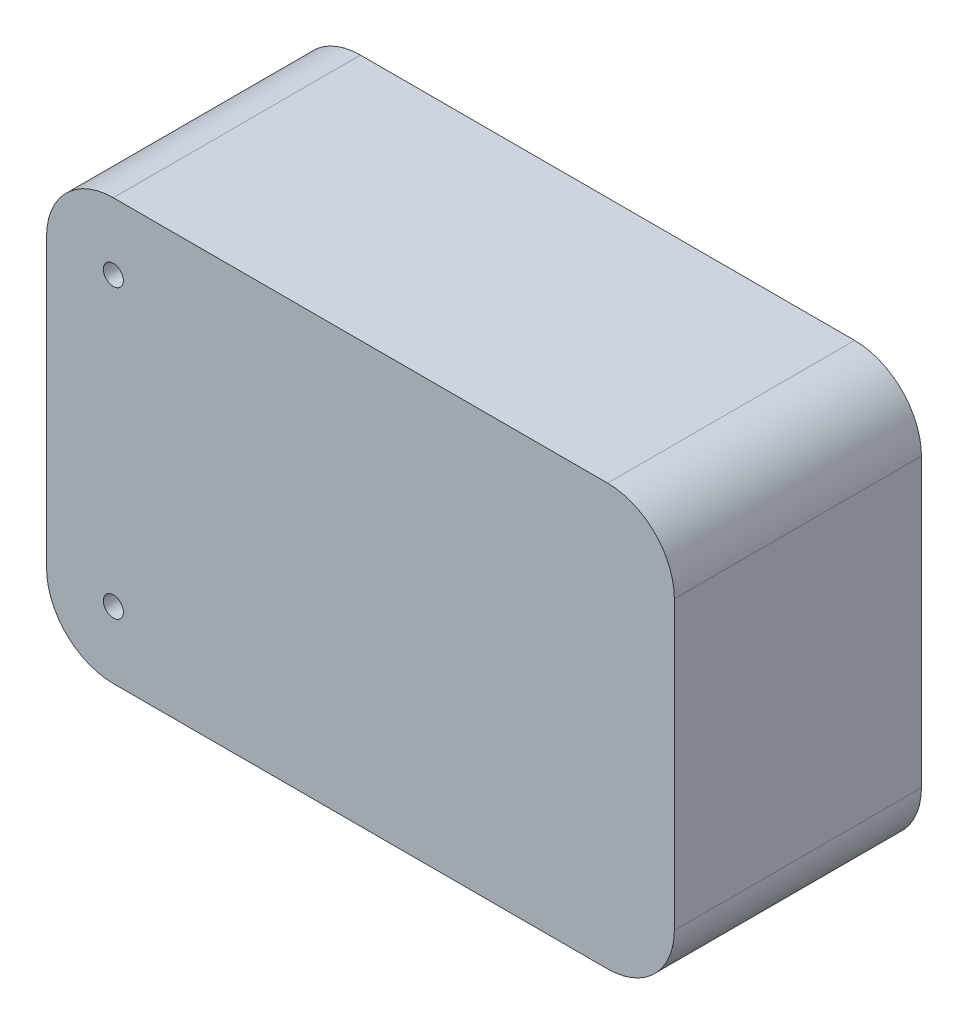
ISO-10303-21;
HEADER;
FILE_DESCRIPTION(('STEP AP214'),'2;1');
FILE_NAME('part.step','',(''),(''),'','','');
FILE_SCHEMA(('AUTOMOTIVE_DESIGN { 1 0 10303 214 1 1 1 1 }'));
ENDSEC;
DATA;
#1=APPLICATION_CONTEXT('core data for automotive mechanical design processes');
#2=APPLICATION_PROTOCOL_DEFINITION('international standard','automotive_design',2000,#1);
#3=PRODUCT_CONTEXT('',#1,'mechanical');
#4=PRODUCT('Part','Part','',(#3));
#5=PRODUCT_RELATED_PRODUCT_CATEGORY('part','',(#4));
#6=PRODUCT_DEFINITION_FORMATION('','',#4);
#7=PRODUCT_DEFINITION_CONTEXT('part definition',#1,'design');
#8=PRODUCT_DEFINITION('design','',#6,#7);
#9=PRODUCT_DEFINITION_SHAPE('','',#8);
#10=(LENGTH_UNIT() NAMED_UNIT(*) SI_UNIT(.MILLI.,.METRE.));
#11=(NAMED_UNIT(*) PLANE_ANGLE_UNIT() SI_UNIT($,.RADIAN.));
#12=(NAMED_UNIT(*) SI_UNIT($,.STERADIAN.) SOLID_ANGLE_UNIT());
#13=UNCERTAINTY_MEASURE_WITH_UNIT(LENGTH_MEASURE(1.E-05),#10,'distance_accuracy_value','');
#14=(GEOMETRIC_REPRESENTATION_CONTEXT(3) GLOBAL_UNCERTAINTY_ASSIGNED_CONTEXT((#13)) GLOBAL_UNIT_ASSIGNED_CONTEXT((#10,
#11,#12)) REPRESENTATION_CONTEXT('',''));
#15=CARTESIAN_POINT('',(0.,0.,0.));
#16=DIRECTION('',(0.,0.,1.));
#17=DIRECTION('',(1.,0.,0.));
#18=AXIS2_PLACEMENT_3D('',#15,#16,#17);
#19=CARTESIAN_POINT('',(-49.5555555555556,31.,37.));
#20=DIRECTION('',(1.,0.,0.));
#21=DIRECTION('',(0.,0.,-1.));
#22=AXIS2_PLACEMENT_3D('',#19,#20,#21);
#23=PLANE('',#22);
#24=DIRECTION('',(0.,-1.,0.));
#25=VECTOR('',#24,1.);
#26=CARTESIAN_POINT('',(-49.5555555555556,31.,37.));
#27=LINE('',#26,#25);
#28=CARTESIAN_POINT('',(-49.5555555555556,21.,37.));
#29=VERTEX_POINT('',#28);
#30=CARTESIAN_POINT('',(-49.5555555555556,-22.,37.));
#31=VERTEX_POINT('',#30);
#32=EDGE_CURVE('E116',#29,#31,#27,.T.);
#33=ORIENTED_EDGE('',*,*,#32,.F.);
#34=DIRECTION('',(0.,0.,-1.));
#35=VECTOR('',#34,1.);
#36=CARTESIAN_POINT('',(-49.5555555555556,21.,37.));
#37=LINE('',#36,#35);
#38=CARTESIAN_POINT('',(-49.5555555555556,21.,0.));
#39=VERTEX_POINT('',#38);
#40=EDGE_CURVE('E101',#29,#39,#37,.T.);
#41=ORIENTED_EDGE('',*,*,#40,.T.);
#42=DIRECTION('',(0.,-1.,0.));
#43=VECTOR('',#42,1.);
#44=CARTESIAN_POINT('',(-49.5555555555556,31.,0.));
#45=LINE('',#44,#43);
#46=CARTESIAN_POINT('',(-49.5555555555556,-22.,0.));
#47=VERTEX_POINT('',#46);
#48=EDGE_CURVE('E113',#39,#47,#45,.T.);
#49=ORIENTED_EDGE('',*,*,#48,.T.);
#50=DIRECTION('',(0.,0.,-1.));
#51=VECTOR('',#50,1.);
#52=CARTESIAN_POINT('',(-49.5555555555556,-22.,37.));
#53=LINE('',#52,#51);
#54=EDGE_CURVE('E118',#47,#31,#53,.F.);
#55=ORIENTED_EDGE('',*,*,#54,.T.);
#56=EDGE_LOOP('',(#33,#41,#49,#55));
#57=FACE_BOUND('',#56,.T.);
#58=ADVANCED_FACE('F32',(#57),#23,.F.);
#59=CARTESIAN_POINT('',(-49.5555555555556,-32.,37.));
#60=DIRECTION('',(0.,1.,0.));
#61=DIRECTION('',(0.,0.,1.));
#62=AXIS2_PLACEMENT_3D('',#59,#60,#61);
#63=PLANE('',#62);
#64=DIRECTION('',(1.,0.,0.));
#65=VECTOR('',#64,1.);
#66=CARTESIAN_POINT('',(-49.5555555555556,-32.,37.));
#67=LINE('',#66,#65);
#68=CARTESIAN_POINT('',(-39.5555555555556,-32.,37.));
#69=VERTEX_POINT('',#68);
#70=CARTESIAN_POINT('',(34.4444444444445,-32.,37.));
#71=VERTEX_POINT('',#70);
#72=EDGE_CURVE('E171',#69,#71,#67,.T.);
#73=ORIENTED_EDGE('',*,*,#72,.F.);
#74=DIRECTION('',(0.,0.,-1.));
#75=VECTOR('',#74,1.);
#76=CARTESIAN_POINT('',(-39.5555555555556,-32.,37.));
#77=LINE('',#76,#75);
#78=CARTESIAN_POINT('',(-39.5555555555556,-32.,0.));
#79=VERTEX_POINT('',#78);
#80=EDGE_CURVE('E155',#69,#79,#77,.T.);
#81=ORIENTED_EDGE('',*,*,#80,.T.);
#82=DIRECTION('',(1.,0.,0.));
#83=VECTOR('',#82,1.);
#84=CARTESIAN_POINT('',(-49.5555555555556,-32.,0.));
#85=LINE('',#84,#83);
#86=CARTESIAN_POINT('',(34.4444444444445,-32.,0.));
#87=VERTEX_POINT('',#86);
#88=EDGE_CURVE('E122',#79,#87,#85,.T.);
#89=ORIENTED_EDGE('',*,*,#88,.T.);
#90=DIRECTION('',(0.,0.,-1.));
#91=VECTOR('',#90,1.);
#92=CARTESIAN_POINT('',(34.4444444444445,-32.,37.));
#93=LINE('',#92,#91);
#94=EDGE_CURVE('E153',#87,#71,#93,.F.);
#95=ORIENTED_EDGE('',*,*,#94,.T.);
#96=EDGE_LOOP('',(#73,#81,#89,#95));
#97=FACE_BOUND('',#96,.T.);
#98=ADVANCED_FACE('F211',(#97),#63,.F.);
#99=CARTESIAN_POINT('',(44.4444444444444,31.,37.));
#100=DIRECTION('',(-1.,0.,0.));
#101=DIRECTION('',(0.,-1.,0.));
#102=AXIS2_PLACEMENT_3D('',#99,#100,#101);
#103=PLANE('',#102);
#104=DIRECTION('',(0.,1.,0.));
#105=VECTOR('',#104,1.);
#106=CARTESIAN_POINT('',(44.4444444444444,31.,0.));
#107=LINE('',#106,#105);
#108=CARTESIAN_POINT('',(44.4444444444445,-22.,0.));
#109=VERTEX_POINT('',#108);
#110=CARTESIAN_POINT('',(44.4444444444444,21.,0.));
#111=VERTEX_POINT('',#110);
#112=EDGE_CURVE('E126',#109,#111,#107,.T.);
#113=ORIENTED_EDGE('',*,*,#112,.T.);
#114=DIRECTION('',(0.,0.,-1.));
#115=VECTOR('',#114,1.);
#116=CARTESIAN_POINT('',(44.4444444444444,21.,37.));
#117=LINE('',#116,#115);
#118=CARTESIAN_POINT('',(44.4444444444444,21.,37.));
#119=VERTEX_POINT('',#118);
#120=EDGE_CURVE('E11',#111,#119,#117,.F.);
#121=ORIENTED_EDGE('',*,*,#120,.T.);
#122=DIRECTION('',(0.,1.,0.));
#123=VECTOR('',#122,1.);
#124=CARTESIAN_POINT('',(44.4444444444444,31.,37.));
#125=LINE('',#124,#123);
#126=CARTESIAN_POINT('',(44.4444444444445,-22.,37.));
#127=VERTEX_POINT('',#126);
#128=EDGE_CURVE('E161',#127,#119,#125,.T.);
#129=ORIENTED_EDGE('',*,*,#128,.F.);
#130=DIRECTION('',(0.,0.,-1.));
#131=VECTOR('',#130,1.);
#132=CARTESIAN_POINT('',(44.4444444444445,-22.,37.));
#133=LINE('',#132,#131);
#134=EDGE_CURVE('E40',#127,#109,#133,.T.);
#135=ORIENTED_EDGE('',*,*,#134,.T.);
#136=EDGE_LOOP('',(#113,#121,#129,#135));
#137=FACE_BOUND('',#136,.T.);
#138=ADVANCED_FACE('F160',(#137),#103,.F.);
#139=CARTESIAN_POINT('',(-49.5555555555556,31.,37.));
#140=DIRECTION('',(0.,-1.,0.));
#141=DIRECTION('',(0.,0.,-1.));
#142=AXIS2_PLACEMENT_3D('',#139,#140,#141);
#143=PLANE('',#142);
#144=DIRECTION('',(-1.,0.,0.));
#145=VECTOR('',#144,1.);
#146=CARTESIAN_POINT('',(-49.5555555555556,31.,0.));
#147=LINE('',#146,#145);
#148=CARTESIAN_POINT('',(34.4444444444444,31.,0.));
#149=VERTEX_POINT('',#148);
#150=CARTESIAN_POINT('',(-39.5555555555556,31.,0.));
#151=VERTEX_POINT('',#150);
#152=EDGE_CURVE('E136',#149,#151,#147,.T.);
#153=ORIENTED_EDGE('',*,*,#152,.T.);
#154=DIRECTION('',(0.,0.,-1.));
#155=VECTOR('',#154,1.);
#156=CARTESIAN_POINT('',(-39.5555555555556,31.,37.));
#157=LINE('',#156,#155);
#158=CARTESIAN_POINT('',(-39.5555555555556,31.,37.));
#159=VERTEX_POINT('',#158);
#160=EDGE_CURVE('E102',#151,#159,#157,.F.);
#161=ORIENTED_EDGE('',*,*,#160,.T.);
#162=DIRECTION('',(-1.,0.,0.));
#163=VECTOR('',#162,1.);
#164=CARTESIAN_POINT('',(-49.5555555555556,31.,37.));
#165=LINE('',#164,#163);
#166=CARTESIAN_POINT('',(34.4444444444444,31.,37.));
#167=VERTEX_POINT('',#166);
#168=EDGE_CURVE('E132',#167,#159,#165,.T.);
#169=ORIENTED_EDGE('',*,*,#168,.F.);
#170=DIRECTION('',(0.,0.,-1.));
#171=VECTOR('',#170,1.);
#172=CARTESIAN_POINT('',(34.4444444444444,31.,37.));
#173=LINE('',#172,#171);
#174=EDGE_CURVE('E107',#167,#149,#173,.T.);
#175=ORIENTED_EDGE('',*,*,#174,.T.);
#176=EDGE_LOOP('',(#153,#161,#169,#175));
#177=FACE_BOUND('',#176,.T.);
#178=ADVANCED_FACE('F169',(#177),#143,.F.);
#179=CARTESIAN_POINT('',(0.,0.,37.));
#180=DIRECTION('',(0.,0.,1.));
#181=DIRECTION('',(1.,0.,0.));
#182=AXIS2_PLACEMENT_3D('',#179,#180,#181);
#183=PLANE('',#182);
#184=CARTESIAN_POINT('',(-39.5555555555556,21.,37.));
#185=DIRECTION('',(0.,0.,1.));
#186=DIRECTION('',(1.,0.,0.));
#187=AXIS2_PLACEMENT_3D('',#184,#185,#186);
#188=CIRCLE('',#187,1.5);
#189=CARTESIAN_POINT('',(-38.0555555555556,21.,37.));
#190=VERTEX_POINT('',#189);
#191=EDGE_CURVE('E178',#190,#190,#188,.T.);
#192=ORIENTED_EDGE('',*,*,#191,.F.);
#193=EDGE_LOOP('',(#192));
#194=FACE_BOUND('',#193,.T.);
#195=CARTESIAN_POINT('',(-39.5555555555556,-22.,37.));
#196=DIRECTION('',(0.,0.,1.));
#197=DIRECTION('',(1.,0.,0.));
#198=AXIS2_PLACEMENT_3D('',#195,#196,#197);
#199=CIRCLE('',#198,1.5);
#200=CARTESIAN_POINT('',(-38.0555555555556,-22.,37.));
#201=VERTEX_POINT('',#200);
#202=EDGE_CURVE('E129',#201,#201,#199,.T.);
#203=ORIENTED_EDGE('',*,*,#202,.F.);
#204=EDGE_LOOP('',(#203));
#205=FACE_BOUND('',#204,.T.);
#206=ORIENTED_EDGE('',*,*,#168,.T.);
#207=CARTESIAN_POINT('',(-39.5555555555556,21.,37.));
#208=DIRECTION('',(0.,0.,1.));
#209=DIRECTION('',(1.,0.,0.));
#210=AXIS2_PLACEMENT_3D('',#207,#208,#209);
#211=CIRCLE('',#210,10.);
#212=EDGE_CURVE('E151',#159,#29,#211,.T.);
#213=ORIENTED_EDGE('',*,*,#212,.T.);
#214=ORIENTED_EDGE('',*,*,#32,.T.);
#215=CARTESIAN_POINT('',(-39.5555555555556,-22.,37.));
#216=DIRECTION('',(0.,0.,1.));
#217=DIRECTION('',(1.,0.,0.));
#218=AXIS2_PLACEMENT_3D('',#215,#216,#217);
#219=CIRCLE('',#218,10.);
#220=EDGE_CURVE('E149',#31,#69,#219,.T.);
#221=ORIENTED_EDGE('',*,*,#220,.T.);
#222=ORIENTED_EDGE('',*,*,#72,.T.);
#223=CARTESIAN_POINT('',(34.4444444444445,-22.,37.));
#224=DIRECTION('',(0.,0.,1.));
#225=DIRECTION('',(1.,0.,0.));
#226=AXIS2_PLACEMENT_3D('',#223,#224,#225);
#227=CIRCLE('',#226,10.);
#228=EDGE_CURVE('E52',#71,#127,#227,.T.);
#229=ORIENTED_EDGE('',*,*,#228,.T.);
#230=ORIENTED_EDGE('',*,*,#128,.T.);
#231=CARTESIAN_POINT('',(34.4444444444444,21.,37.));
#232=DIRECTION('',(0.,0.,1.));
#233=DIRECTION('',(1.,0.,0.));
#234=AXIS2_PLACEMENT_3D('',#231,#232,#233);
#235=CIRCLE('',#234,10.);
#236=EDGE_CURVE('E147',#119,#167,#235,.T.);
#237=ORIENTED_EDGE('',*,*,#236,.T.);
#238=EDGE_LOOP('',(#206,#213,#214,#221,#222,#229,#230,#237));
#239=FACE_BOUND('',#238,.T.);
#240=ADVANCED_FACE('F193',(#194,#205,#239),#183,.T.);
#241=CARTESIAN_POINT('',(0.,0.,0.));
#242=DIRECTION('',(0.,0.,1.));
#243=DIRECTION('',(1.,0.,0.));
#244=AXIS2_PLACEMENT_3D('',#241,#242,#243);
#245=PLANE('',#244);
#246=ORIENTED_EDGE('',*,*,#48,.F.);
#247=CARTESIAN_POINT('',(-39.5555555555556,21.,0.));
#248=DIRECTION('',(0.,0.,1.));
#249=DIRECTION('',(1.,0.,0.));
#250=AXIS2_PLACEMENT_3D('',#247,#248,#249);
#251=CIRCLE('',#250,10.);
#252=EDGE_CURVE('E97',#39,#151,#251,.F.);
#253=ORIENTED_EDGE('',*,*,#252,.T.);
#254=ORIENTED_EDGE('',*,*,#152,.F.);
#255=CARTESIAN_POINT('',(34.4444444444444,21.,0.));
#256=DIRECTION('',(0.,0.,1.));
#257=DIRECTION('',(1.,0.,0.));
#258=AXIS2_PLACEMENT_3D('',#255,#256,#257);
#259=CIRCLE('',#258,10.);
#260=EDGE_CURVE('E140',#149,#111,#259,.F.);
#261=ORIENTED_EDGE('',*,*,#260,.T.);
#262=ORIENTED_EDGE('',*,*,#112,.F.);
#263=CARTESIAN_POINT('',(34.4444444444445,-22.,0.));
#264=DIRECTION('',(0.,0.,1.));
#265=DIRECTION('',(1.,0.,0.));
#266=AXIS2_PLACEMENT_3D('',#263,#264,#265);
#267=CIRCLE('',#266,10.);
#268=EDGE_CURVE('E117',#109,#87,#267,.F.);
#269=ORIENTED_EDGE('',*,*,#268,.T.);
#270=ORIENTED_EDGE('',*,*,#88,.F.);
#271=CARTESIAN_POINT('',(-39.5555555555556,-22.,0.));
#272=DIRECTION('',(0.,0.,1.));
#273=DIRECTION('',(1.,0.,0.));
#274=AXIS2_PLACEMENT_3D('',#271,#272,#273);
#275=CIRCLE('',#274,10.);
#276=EDGE_CURVE('E108',#79,#47,#275,.F.);
#277=ORIENTED_EDGE('',*,*,#276,.T.);
#278=EDGE_LOOP('',(#246,#253,#254,#261,#262,#269,#270,#277));
#279=FACE_BOUND('',#278,.T.);
#280=ADVANCED_FACE('F120',(#279),#245,.F.);
#281=CARTESIAN_POINT('',(-39.5555555555556,21.,37.));
#282=DIRECTION('',(0.,0.,-1.));
#283=DIRECTION('',(-1.,0.,0.));
#284=AXIS2_PLACEMENT_3D('',#281,#282,#283);
#285=CYLINDRICAL_SURFACE('',#284,10.);
#286=ORIENTED_EDGE('',*,*,#212,.F.);
#287=ORIENTED_EDGE('',*,*,#160,.F.);
#288=ORIENTED_EDGE('',*,*,#252,.F.);
#289=ORIENTED_EDGE('',*,*,#40,.F.);
#290=EDGE_LOOP('',(#286,#287,#288,#289));
#291=FACE_BOUND('',#290,.T.);
#292=ADVANCED_FACE('F100',(#291),#285,.T.);
#293=CARTESIAN_POINT('',(-39.5555555555556,-22.,37.));
#294=DIRECTION('',(0.,0.,-1.));
#295=DIRECTION('',(-1.,0.,0.));
#296=AXIS2_PLACEMENT_3D('',#293,#294,#295);
#297=CYLINDRICAL_SURFACE('',#296,10.);
#298=ORIENTED_EDGE('',*,*,#220,.F.);
#299=ORIENTED_EDGE('',*,*,#54,.F.);
#300=ORIENTED_EDGE('',*,*,#276,.F.);
#301=ORIENTED_EDGE('',*,*,#80,.F.);
#302=EDGE_LOOP('',(#298,#299,#300,#301));
#303=FACE_BOUND('',#302,.T.);
#304=ADVANCED_FACE('F222',(#303),#297,.T.);
#305=CARTESIAN_POINT('',(34.4444444444444,21.,37.));
#306=DIRECTION('',(0.,0.,-1.));
#307=DIRECTION('',(-1.,0.,0.));
#308=AXIS2_PLACEMENT_3D('',#305,#306,#307);
#309=CYLINDRICAL_SURFACE('',#308,10.);
#310=ORIENTED_EDGE('',*,*,#236,.F.);
#311=ORIENTED_EDGE('',*,*,#120,.F.);
#312=ORIENTED_EDGE('',*,*,#260,.F.);
#313=ORIENTED_EDGE('',*,*,#174,.F.);
#314=EDGE_LOOP('',(#310,#311,#312,#313));
#315=FACE_BOUND('',#314,.T.);
#316=ADVANCED_FACE('F166',(#315),#309,.T.);
#317=CARTESIAN_POINT('',(34.4444444444445,-22.,37.));
#318=DIRECTION('',(0.,0.,-1.));
#319=DIRECTION('',(-1.,0.,0.));
#320=AXIS2_PLACEMENT_3D('',#317,#318,#319);
#321=CYLINDRICAL_SURFACE('',#320,10.);
#322=ORIENTED_EDGE('',*,*,#228,.F.);
#323=ORIENTED_EDGE('',*,*,#94,.F.);
#324=ORIENTED_EDGE('',*,*,#268,.F.);
#325=ORIENTED_EDGE('',*,*,#134,.F.);
#326=EDGE_LOOP('',(#322,#323,#324,#325));
#327=FACE_BOUND('',#326,.T.);
#328=ADVANCED_FACE('F34',(#327),#321,.T.);
#329=CARTESIAN_POINT('',(-39.5555555555556,-22.,27.));
#330=DIRECTION('',(0.,0.,1.));
#331=DIRECTION('',(1.,0.,0.));
#332=AXIS2_PLACEMENT_3D('',#329,#330,#331);
#333=CYLINDRICAL_SURFACE('',#332,1.5);
#334=CARTESIAN_POINT('',(-39.5555555555556,-22.,27.));
#335=DIRECTION('',(0.,0.,1.));
#336=DIRECTION('',(1.,0.,0.));
#337=AXIS2_PLACEMENT_3D('',#334,#335,#336);
#338=CIRCLE('',#337,1.5);
#339=CARTESIAN_POINT('',(-38.0555555555556,-22.,27.));
#340=VERTEX_POINT('',#339);
#341=EDGE_CURVE('E123',#340,#340,#338,.T.);
#342=ORIENTED_EDGE('',*,*,#341,.F.);
#343=EDGE_LOOP('',(#342));
#344=FACE_BOUND('',#343,.T.);
#345=ORIENTED_EDGE('',*,*,#202,.T.);
#346=EDGE_LOOP('',(#345));
#347=FACE_BOUND('',#346,.T.);
#348=ADVANCED_FACE('F199',(#344,#347),#333,.F.);
#349=CARTESIAN_POINT('',(-39.5555555555556,-22.,27.));
#350=DIRECTION('',(0.,0.,1.));
#351=DIRECTION('',(1.,0.,0.));
#352=AXIS2_PLACEMENT_3D('',#349,#350,#351);
#353=PLANE('',#352);
#354=ORIENTED_EDGE('',*,*,#341,.T.);
#355=EDGE_LOOP('',(#354));
#356=FACE_BOUND('',#355,.T.);
#357=ADVANCED_FACE('F189',(#356),#353,.T.);
#358=CARTESIAN_POINT('',(-39.5555555555556,21.,27.));
#359=DIRECTION('',(0.,0.,1.));
#360=DIRECTION('',(1.,0.,0.));
#361=AXIS2_PLACEMENT_3D('',#358,#359,#360);
#362=CYLINDRICAL_SURFACE('',#361,1.5);
#363=CARTESIAN_POINT('',(-39.5555555555556,21.,27.));
#364=DIRECTION('',(0.,0.,1.));
#365=DIRECTION('',(1.,0.,0.));
#366=AXIS2_PLACEMENT_3D('',#363,#364,#365);
#367=CIRCLE('',#366,1.5);
#368=CARTESIAN_POINT('',(-38.0555555555556,21.,27.));
#369=VERTEX_POINT('',#368);
#370=EDGE_CURVE('E176',#369,#369,#367,.T.);
#371=ORIENTED_EDGE('',*,*,#370,.F.);
#372=EDGE_LOOP('',(#371));
#373=FACE_BOUND('',#372,.T.);
#374=ORIENTED_EDGE('',*,*,#191,.T.);
#375=EDGE_LOOP('',(#374));
#376=FACE_BOUND('',#375,.T.);
#377=ADVANCED_FACE('F186',(#373,#376),#362,.F.);
#378=CARTESIAN_POINT('',(-39.5555555555556,21.,27.));
#379=DIRECTION('',(0.,0.,1.));
#380=DIRECTION('',(1.,0.,0.));
#381=AXIS2_PLACEMENT_3D('',#378,#379,#380);
#382=PLANE('',#381);
#383=ORIENTED_EDGE('',*,*,#370,.T.);
#384=EDGE_LOOP('',(#383));
#385=FACE_BOUND('',#384,.T.);
#386=ADVANCED_FACE('F184',(#385),#382,.T.);
#387=CLOSED_SHELL('',(#58,#98,#138,#178,#240,#280,#292,#304,#316,#328,#348,#357,#377,#386));
#388=MANIFOLD_SOLID_BREP('B2',#387);
#389=ADVANCED_BREP_SHAPE_REPRESENTATION('',(#18,#388),#14);
#390=SHAPE_DEFINITION_REPRESENTATION(#9,#389);
ENDSEC;
END-ISO-10303-21;
